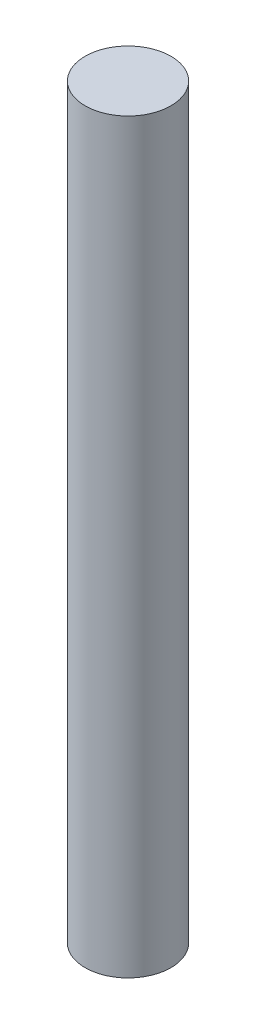
ISO-10303-21;
HEADER;
FILE_DESCRIPTION(('STEP AP214'),'2;1');
FILE_NAME('part.step','',(''),(''),'','','');
FILE_SCHEMA(('AUTOMOTIVE_DESIGN { 1 0 10303 214 1 1 1 1 }'));
ENDSEC;
DATA;
#1=APPLICATION_CONTEXT('core data for automotive mechanical design processes');
#2=APPLICATION_PROTOCOL_DEFINITION('international standard','automotive_design',2000,#1);
#3=PRODUCT_CONTEXT('',#1,'mechanical');
#4=PRODUCT('Part','Part','',(#3));
#5=PRODUCT_RELATED_PRODUCT_CATEGORY('part','',(#4));
#6=PRODUCT_DEFINITION_FORMATION('','',#4);
#7=PRODUCT_DEFINITION_CONTEXT('part definition',#1,'design');
#8=PRODUCT_DEFINITION('design','',#6,#7);
#9=PRODUCT_DEFINITION_SHAPE('','',#8);
#10=(LENGTH_UNIT() NAMED_UNIT(*) SI_UNIT(.MILLI.,.METRE.));
#11=(NAMED_UNIT(*) PLANE_ANGLE_UNIT() SI_UNIT($,.RADIAN.));
#12=(NAMED_UNIT(*) SI_UNIT($,.STERADIAN.) SOLID_ANGLE_UNIT());
#13=UNCERTAINTY_MEASURE_WITH_UNIT(LENGTH_MEASURE(1.E-05),#10,'distance_accuracy_value','');
#14=(GEOMETRIC_REPRESENTATION_CONTEXT(3) GLOBAL_UNCERTAINTY_ASSIGNED_CONTEXT((#13)) GLOBAL_UNIT_ASSIGNED_CONTEXT((#10,
#11,#12)) REPRESENTATION_CONTEXT('',''));
#15=CARTESIAN_POINT('',(0.,0.,0.));
#16=DIRECTION('',(0.,0.,1.));
#17=DIRECTION('',(1.,0.,0.));
#18=AXIS2_PLACEMENT_3D('',#15,#16,#17);
#19=CARTESIAN_POINT('',(0.,25.4,0.));
#20=DIRECTION('',(0.,-1.,0.));
#21=DIRECTION('',(0.,0.,-1.));
#22=AXIS2_PLACEMENT_3D('',#19,#20,#21);
#23=CYLINDRICAL_SURFACE('',#22,1.4605);
#24=CARTESIAN_POINT('',(0.,25.4,0.));
#25=DIRECTION('',(0.,1.,0.));
#26=DIRECTION('',(0.,0.,1.));
#27=AXIS2_PLACEMENT_3D('',#24,#25,#26);
#28=CIRCLE('',#27,1.4605);
#29=CARTESIAN_POINT('',(0.,25.4,-1.4605));
#30=VERTEX_POINT('',#29);
#31=EDGE_CURVE('E10',#30,#30,#28,.T.);
#32=CARTESIAN_POINT('',(0.,0.,0.));
#33=DIRECTION('',(0.,1.,0.));
#34=DIRECTION('',(0.,0.,1.));
#35=AXIS2_PLACEMENT_3D('',#32,#33,#34);
#36=CIRCLE('',#35,1.4605);
#37=CARTESIAN_POINT('',(0.,0.,-1.4605));
#38=VERTEX_POINT('',#37);
#39=EDGE_CURVE('E34',#38,#38,#36,.T.);
#40=CARTESIAN_POINT('',(0.,25.4,-1.4605));
#41=CARTESIAN_POINT('',(0.,25.1354166666667,-1.4605));
#42=CARTESIAN_POINT('',(0.,24.8708333333333,-1.4605));
#43=CARTESIAN_POINT('',(0.,24.3416666666667,-1.4605));
#44=CARTESIAN_POINT('',(0.,24.0770833333333,-1.4605));
#45=CARTESIAN_POINT('',(0.,23.5479166666667,-1.4605));
#46=CARTESIAN_POINT('',(0.,23.2833333333333,-1.4605));
#47=CARTESIAN_POINT('',(0.,22.7541666666667,-1.4605));
#48=CARTESIAN_POINT('',(0.,22.4895833333333,-1.4605));
#49=CARTESIAN_POINT('',(0.,21.9604166666667,-1.4605));
#50=CARTESIAN_POINT('',(0.,21.6958333333333,-1.4605));
#51=CARTESIAN_POINT('',(0.,21.1666666666667,-1.4605));
#52=CARTESIAN_POINT('',(0.,20.9020833333333,-1.4605));
#53=CARTESIAN_POINT('',(0.,20.3729166666667,-1.4605));
#54=CARTESIAN_POINT('',(0.,20.1083333333333,-1.4605));
#55=CARTESIAN_POINT('',(0.,19.5791666666667,-1.4605));
#56=CARTESIAN_POINT('',(0.,19.3145833333333,-1.4605));
#57=CARTESIAN_POINT('',(0.,18.7854166666667,-1.4605));
#58=CARTESIAN_POINT('',(0.,18.5208333333333,-1.4605));
#59=CARTESIAN_POINT('',(0.,17.9916666666667,-1.4605));
#60=CARTESIAN_POINT('',(0.,17.7270833333333,-1.4605));
#61=CARTESIAN_POINT('',(0.,17.1979166666667,-1.4605));
#62=CARTESIAN_POINT('',(0.,16.9333333333333,-1.4605));
#63=CARTESIAN_POINT('',(0.,16.4041666666667,-1.4605));
#64=CARTESIAN_POINT('',(0.,16.1395833333333,-1.4605));
#65=CARTESIAN_POINT('',(0.,15.6104166666667,-1.4605));
#66=CARTESIAN_POINT('',(0.,15.3458333333333,-1.4605));
#67=CARTESIAN_POINT('',(0.,14.8166666666667,-1.4605));
#68=CARTESIAN_POINT('',(0.,14.5520833333333,-1.4605));
#69=CARTESIAN_POINT('',(0.,14.0229166666667,-1.4605));
#70=CARTESIAN_POINT('',(0.,13.7583333333333,-1.4605));
#71=CARTESIAN_POINT('',(0.,13.2291666666667,-1.4605));
#72=CARTESIAN_POINT('',(0.,12.9645833333333,-1.4605));
#73=CARTESIAN_POINT('',(0.,12.4354166666667,-1.4605));
#74=CARTESIAN_POINT('',(0.,12.1708333333333,-1.4605));
#75=CARTESIAN_POINT('',(0.,11.6416666666667,-1.4605));
#76=CARTESIAN_POINT('',(0.,11.3770833333333,-1.4605));
#77=CARTESIAN_POINT('',(0.,10.8479166666667,-1.4605));
#78=CARTESIAN_POINT('',(0.,10.5833333333333,-1.4605));
#79=CARTESIAN_POINT('',(0.,10.0541666666667,-1.4605));
#80=CARTESIAN_POINT('',(0.,9.78958333333334,-1.4605));
#81=CARTESIAN_POINT('',(0.,9.26041666666667,-1.4605));
#82=CARTESIAN_POINT('',(0.,8.99583333333333,-1.4605));
#83=CARTESIAN_POINT('',(0.,8.46666666666667,-1.4605));
#84=CARTESIAN_POINT('',(0.,8.20208333333333,-1.4605));
#85=CARTESIAN_POINT('',(0.,7.67291666666667,-1.4605));
#86=CARTESIAN_POINT('',(0.,7.40833333333333,-1.4605));
#87=CARTESIAN_POINT('',(0.,6.87916666666667,-1.4605));
#88=CARTESIAN_POINT('',(0.,6.61458333333333,-1.4605));
#89=CARTESIAN_POINT('',(0.,6.08541666666667,-1.4605));
#90=CARTESIAN_POINT('',(0.,5.82083333333333,-1.4605));
#91=CARTESIAN_POINT('',(0.,5.29166666666667,-1.4605));
#92=CARTESIAN_POINT('',(0.,5.02708333333333,-1.4605));
#93=CARTESIAN_POINT('',(0.,4.49791666666667,-1.4605));
#94=CARTESIAN_POINT('',(0.,4.23333333333333,-1.4605));
#95=CARTESIAN_POINT('',(0.,3.70416666666667,-1.4605));
#96=CARTESIAN_POINT('',(0.,3.43958333333333,-1.4605));
#97=CARTESIAN_POINT('',(0.,2.91041666666667,-1.4605));
#98=CARTESIAN_POINT('',(0.,2.64583333333333,-1.4605));
#99=CARTESIAN_POINT('',(0.,2.11666666666667,-1.4605));
#100=CARTESIAN_POINT('',(0.,1.85208333333333,-1.4605));
#101=CARTESIAN_POINT('',(0.,1.32291666666667,-1.4605));
#102=CARTESIAN_POINT('',(0.,1.05833333333333,-1.4605));
#103=CARTESIAN_POINT('',(0.,0.529166666666666,-1.4605));
#104=CARTESIAN_POINT('',(0.,0.264583333333333,-1.4605));
#105=CARTESIAN_POINT('',(0.,0.,-1.4605));
#106=B_SPLINE_CURVE_WITH_KNOTS('',3,(#40,#41,#42,#43,#44,#45,#46,#47,#48,#49,#50,#51,#52,#53,
#54,#55,#56,#57,#58,#59,#60,#61,#62,#63,#64,#65,#66,#67,#68,#69,#70,#71,#72,#73,#74,#75,#76,#77,
#78,#79,#80,#81,#82,#83,#84,#85,#86,#87,#88,#89,#90,#91,#92,#93,#94,#95,#96,#97,#98,#99,#100,
#101,#102,#103,#104,#105),.UNSPECIFIED.,.F.,.F.,(4,2,2,2,2,2,2,2,2,2,2,2,2,2,2,2,2,2,2,2,2,2,2,
2,2,2,2,2,2,2,2,2,4),(0.,0.793749999999999,1.5875,2.38125,3.175,3.96875,4.7625,5.55625,6.35,
7.14375,7.9375,8.73125,9.525,10.31875,11.1125,11.90625,12.7,13.49375,14.2875,15.08125,15.875,
16.66875,17.4625,18.25625,19.05,19.84375,20.6375,21.43125,22.225,23.01875,23.8125,24.60625,
25.4),.UNSPECIFIED.);
#107=EDGE_CURVE('BSEAM31',#30,#38,#106,.T.);
#108=ORIENTED_EDGE('',*,*,#31,.F.);
#109=ORIENTED_EDGE('',*,*,#39,.T.);
#110=ORIENTED_EDGE('',*,*,#107,.T.);
#111=ORIENTED_EDGE('',*,*,#107,.F.);
#112=EDGE_LOOP('',(#108,#110,#109,#111));
#113=FACE_BOUND('',#112,.T.);
#114=ADVANCED_FACE('F31',(#113),#23,.T.);
#115=CARTESIAN_POINT('',(0.,25.4,0.));
#116=DIRECTION('',(0.,1.,0.));
#117=DIRECTION('',(0.,0.,1.));
#118=AXIS2_PLACEMENT_3D('',#115,#116,#117);
#119=PLANE('',#118);
#120=ORIENTED_EDGE('',*,*,#31,.T.);
#121=EDGE_LOOP('',(#120));
#122=FACE_BOUND('',#121,.T.);
#123=ADVANCED_FACE('F46',(#122),#119,.T.);
#124=CARTESIAN_POINT('',(0.,0.,0.));
#125=DIRECTION('',(0.,1.,0.));
#126=DIRECTION('',(0.,0.,1.));
#127=AXIS2_PLACEMENT_3D('',#124,#125,#126);
#128=PLANE('',#127);
#129=ORIENTED_EDGE('',*,*,#39,.F.);
#130=EDGE_LOOP('',(#129));
#131=FACE_BOUND('',#130,.T.);
#132=ADVANCED_FACE('F44',(#131),#128,.F.);
#133=CLOSED_SHELL('',(#114,#123,#132));
#134=MANIFOLD_SOLID_BREP('B2',#133);
#135=ADVANCED_BREP_SHAPE_REPRESENTATION('',(#18,#134),#14);
#136=SHAPE_DEFINITION_REPRESENTATION(#9,#135);
ENDSEC;
END-ISO-10303-21;
